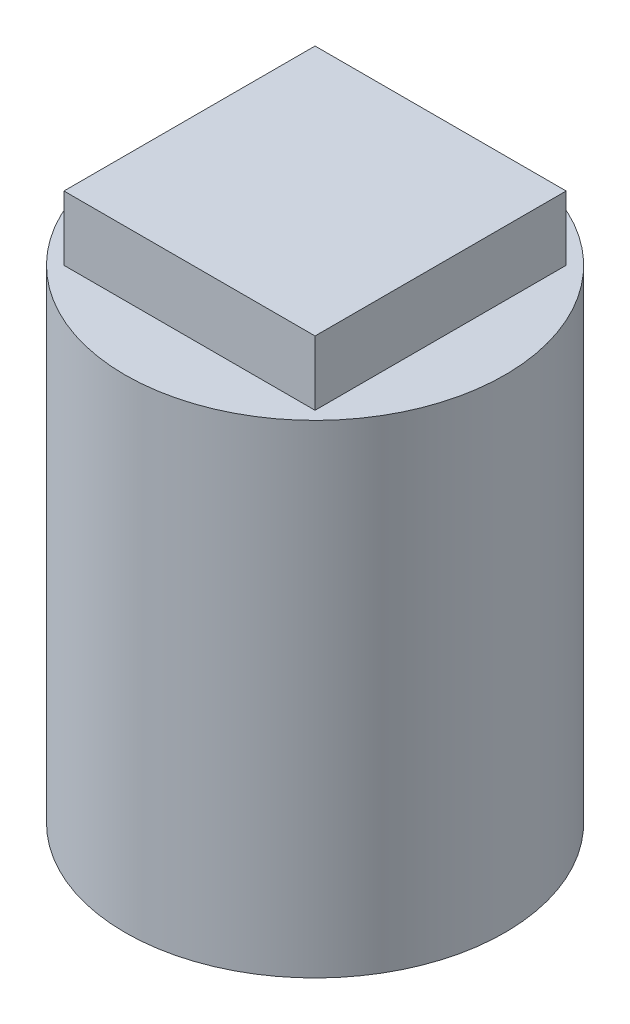
ISO-10303-21;
HEADER;
FILE_DESCRIPTION(('STEP AP214'),'2;1');
FILE_NAME('part.step','',(''),(''),'','','');
FILE_SCHEMA(('AUTOMOTIVE_DESIGN { 1 0 10303 214 1 1 1 1 }'));
ENDSEC;
DATA;
#1=APPLICATION_CONTEXT('core data for automotive mechanical design processes');
#2=APPLICATION_PROTOCOL_DEFINITION('international standard','automotive_design',2000,#1);
#3=PRODUCT_CONTEXT('',#1,'mechanical');
#4=PRODUCT('Part','Part','',(#3));
#5=PRODUCT_RELATED_PRODUCT_CATEGORY('part','',(#4));
#6=PRODUCT_DEFINITION_FORMATION('','',#4);
#7=PRODUCT_DEFINITION_CONTEXT('part definition',#1,'design');
#8=PRODUCT_DEFINITION('design','',#6,#7);
#9=PRODUCT_DEFINITION_SHAPE('','',#8);
#10=(LENGTH_UNIT() NAMED_UNIT(*) SI_UNIT(.MILLI.,.METRE.));
#11=(NAMED_UNIT(*) PLANE_ANGLE_UNIT() SI_UNIT($,.RADIAN.));
#12=(NAMED_UNIT(*) SI_UNIT($,.STERADIAN.) SOLID_ANGLE_UNIT());
#13=UNCERTAINTY_MEASURE_WITH_UNIT(LENGTH_MEASURE(1.E-05),#10,'distance_accuracy_value','');
#14=(GEOMETRIC_REPRESENTATION_CONTEXT(3) GLOBAL_UNCERTAINTY_ASSIGNED_CONTEXT((#13)) GLOBAL_UNIT_ASSIGNED_CONTEXT((#10,
#11,#12)) REPRESENTATION_CONTEXT('',''));
#15=CARTESIAN_POINT('',(0.,0.,0.));
#16=DIRECTION('',(0.,0.,1.));
#17=DIRECTION('',(1.,0.,0.));
#18=AXIS2_PLACEMENT_3D('',#15,#16,#17);
#19=CARTESIAN_POINT('',(0.,7.5,0.));
#20=DIRECTION('',(0.,-1.,0.));
#21=DIRECTION('',(0.,0.,-1.));
#22=AXIS2_PLACEMENT_3D('',#19,#20,#21);
#23=CYLINDRICAL_SURFACE('',#22,2.95);
#24=CARTESIAN_POINT('',(0.,7.5,0.));
#25=DIRECTION('',(0.,1.,0.));
#26=DIRECTION('',(0.,0.,1.));
#27=AXIS2_PLACEMENT_3D('',#24,#25,#26);
#28=CIRCLE('',#27,2.95);
#29=CARTESIAN_POINT('',(0.,7.5,2.95));
#30=VERTEX_POINT('',#29);
#31=EDGE_CURVE('E11',#30,#30,#28,.T.);
#32=ORIENTED_EDGE('',*,*,#31,.F.);
#33=EDGE_LOOP('',(#32));
#34=FACE_BOUND('',#33,.T.);
#35=CARTESIAN_POINT('',(0.,0.,0.));
#36=DIRECTION('',(0.,1.,0.));
#37=DIRECTION('',(0.,0.,1.));
#38=AXIS2_PLACEMENT_3D('',#35,#36,#37);
#39=CIRCLE('',#38,2.95);
#40=CARTESIAN_POINT('',(0.,0.,2.95));
#41=VERTEX_POINT('',#40);
#42=EDGE_CURVE('E42',#41,#41,#39,.T.);
#43=ORIENTED_EDGE('',*,*,#42,.T.);
#44=EDGE_LOOP('',(#43));
#45=FACE_BOUND('',#44,.T.);
#46=ADVANCED_FACE('F39',(#34,#45),#23,.T.);
#47=CARTESIAN_POINT('',(0.,7.5,0.));
#48=DIRECTION('',(0.,1.,0.));
#49=DIRECTION('',(0.,0.,1.));
#50=AXIS2_PLACEMENT_3D('',#47,#48,#49);
#51=PLANE('',#50);
#52=DIRECTION('',(0.,0.,1.));
#53=VECTOR('',#52,1.);
#54=CARTESIAN_POINT('',(-1.95,7.5,-1.95));
#55=LINE('',#54,#53);
#56=CARTESIAN_POINT('',(-1.95,7.5,-1.95));
#57=VERTEX_POINT('',#56);
#58=CARTESIAN_POINT('',(-1.95,7.5,1.95));
#59=VERTEX_POINT('',#58);
#60=EDGE_CURVE('E54',#57,#59,#55,.T.);
#61=ORIENTED_EDGE('',*,*,#60,.F.);
#62=DIRECTION('',(-1.,0.,0.));
#63=VECTOR('',#62,1.);
#64=CARTESIAN_POINT('',(1.95,7.5,-1.95));
#65=LINE('',#64,#63);
#66=CARTESIAN_POINT('',(1.95,7.5,-1.95));
#67=VERTEX_POINT('',#66);
#68=EDGE_CURVE('E58',#67,#57,#65,.T.);
#69=ORIENTED_EDGE('',*,*,#68,.F.);
#70=DIRECTION('',(0.,0.,-1.));
#71=VECTOR('',#70,1.);
#72=CARTESIAN_POINT('',(1.95,7.5,-1.95));
#73=LINE('',#72,#71);
#74=CARTESIAN_POINT('',(1.95,7.5,1.95));
#75=VERTEX_POINT('',#74);
#76=EDGE_CURVE('E118',#75,#67,#73,.T.);
#77=ORIENTED_EDGE('',*,*,#76,.F.);
#78=DIRECTION('',(1.,0.,0.));
#79=VECTOR('',#78,1.);
#80=CARTESIAN_POINT('',(1.95,7.5,1.95));
#81=LINE('',#80,#79);
#82=EDGE_CURVE('E121',#59,#75,#81,.T.);
#83=ORIENTED_EDGE('',*,*,#82,.F.);
#84=EDGE_LOOP('',(#61,#69,#77,#83));
#85=FACE_BOUND('',#84,.T.);
#86=ORIENTED_EDGE('',*,*,#31,.T.);
#87=EDGE_LOOP('',(#86));
#88=FACE_BOUND('',#87,.T.);
#89=ADVANCED_FACE('F143',(#85,#88),#51,.T.);
#90=CARTESIAN_POINT('',(0.,0.,0.));
#91=DIRECTION('',(0.,1.,0.));
#92=DIRECTION('',(0.,0.,1.));
#93=AXIS2_PLACEMENT_3D('',#90,#91,#92);
#94=PLANE('',#93);
#95=ORIENTED_EDGE('',*,*,#42,.F.);
#96=EDGE_LOOP('',(#95));
#97=FACE_BOUND('',#96,.T.);
#98=ADVANCED_FACE('F148',(#97),#94,.F.);
#99=CARTESIAN_POINT('',(-1.95,8.5,-1.95));
#100=DIRECTION('',(1.,0.,0.));
#101=DIRECTION('',(0.,0.,-1.));
#102=AXIS2_PLACEMENT_3D('',#99,#100,#101);
#103=PLANE('',#102);
#104=ORIENTED_EDGE('',*,*,#60,.T.);
#105=DIRECTION('',(0.,-1.,0.));
#106=VECTOR('',#105,1.);
#107=CARTESIAN_POINT('',(-1.95,8.5,1.95));
#108=LINE('',#107,#106);
#109=CARTESIAN_POINT('',(-1.95,8.5,1.95));
#110=VERTEX_POINT('',#109);
#111=EDGE_CURVE('E83',#110,#59,#108,.T.);
#112=ORIENTED_EDGE('',*,*,#111,.F.);
#113=DIRECTION('',(0.,0.,1.));
#114=VECTOR('',#113,1.);
#115=CARTESIAN_POINT('',(-1.95,8.5,-1.95));
#116=LINE('',#115,#114);
#117=CARTESIAN_POINT('',(-1.95,8.5,-1.95));
#118=VERTEX_POINT('',#117);
#119=EDGE_CURVE('E90',#118,#110,#116,.T.);
#120=ORIENTED_EDGE('',*,*,#119,.F.);
#121=DIRECTION('',(0.,-1.,0.));
#122=VECTOR('',#121,1.);
#123=CARTESIAN_POINT('',(-1.95,8.5,-1.95));
#124=LINE('',#123,#122);
#125=EDGE_CURVE('E113',#118,#57,#124,.T.);
#126=ORIENTED_EDGE('',*,*,#125,.T.);
#127=EDGE_LOOP('',(#104,#112,#120,#126));
#128=FACE_BOUND('',#127,.T.);
#129=ADVANCED_FACE('F101',(#128),#103,.F.);
#130=CARTESIAN_POINT('',(1.95,8.5,1.95));
#131=DIRECTION('',(0.,0.,-1.));
#132=DIRECTION('',(-1.,0.,0.));
#133=AXIS2_PLACEMENT_3D('',#130,#131,#132);
#134=PLANE('',#133);
#135=ORIENTED_EDGE('',*,*,#82,.T.);
#136=DIRECTION('',(0.,-1.,0.));
#137=VECTOR('',#136,1.);
#138=CARTESIAN_POINT('',(1.95,8.5,1.95));
#139=LINE('',#138,#137);
#140=CARTESIAN_POINT('',(1.95,8.5,1.95));
#141=VERTEX_POINT('',#140);
#142=EDGE_CURVE('E85',#141,#75,#139,.T.);
#143=ORIENTED_EDGE('',*,*,#142,.F.);
#144=DIRECTION('',(1.,0.,0.));
#145=VECTOR('',#144,1.);
#146=CARTESIAN_POINT('',(1.95,8.5,1.95));
#147=LINE('',#146,#145);
#148=EDGE_CURVE('E78',#110,#141,#147,.T.);
#149=ORIENTED_EDGE('',*,*,#148,.F.);
#150=ORIENTED_EDGE('',*,*,#111,.T.);
#151=EDGE_LOOP('',(#135,#143,#149,#150));
#152=FACE_BOUND('',#151,.T.);
#153=ADVANCED_FACE('F81',(#152),#134,.F.);
#154=CARTESIAN_POINT('',(1.95,8.5,-1.95));
#155=DIRECTION('',(-1.,0.,0.));
#156=DIRECTION('',(0.,0.,1.));
#157=AXIS2_PLACEMENT_3D('',#154,#155,#156);
#158=PLANE('',#157);
#159=ORIENTED_EDGE('',*,*,#76,.T.);
#160=DIRECTION('',(0.,-1.,0.));
#161=VECTOR('',#160,1.);
#162=CARTESIAN_POINT('',(1.95,8.5,-1.95));
#163=LINE('',#162,#161);
#164=CARTESIAN_POINT('',(1.95,8.5,-1.95));
#165=VERTEX_POINT('',#164);
#166=EDGE_CURVE('E107',#165,#67,#163,.T.);
#167=ORIENTED_EDGE('',*,*,#166,.F.);
#168=DIRECTION('',(0.,0.,-1.));
#169=VECTOR('',#168,1.);
#170=CARTESIAN_POINT('',(1.95,8.5,-1.95));
#171=LINE('',#170,#169);
#172=EDGE_CURVE('E89',#141,#165,#171,.T.);
#173=ORIENTED_EDGE('',*,*,#172,.F.);
#174=ORIENTED_EDGE('',*,*,#142,.T.);
#175=EDGE_LOOP('',(#159,#167,#173,#174));
#176=FACE_BOUND('',#175,.T.);
#177=ADVANCED_FACE('F131',(#176),#158,.F.);
#178=CARTESIAN_POINT('',(1.95,8.5,-1.95));
#179=DIRECTION('',(0.,0.,1.));
#180=DIRECTION('',(1.,0.,0.));
#181=AXIS2_PLACEMENT_3D('',#178,#179,#180);
#182=PLANE('',#181);
#183=ORIENTED_EDGE('',*,*,#68,.T.);
#184=ORIENTED_EDGE('',*,*,#125,.F.);
#185=DIRECTION('',(-1.,0.,0.));
#186=VECTOR('',#185,1.);
#187=CARTESIAN_POINT('',(1.95,8.5,-1.95));
#188=LINE('',#187,#186);
#189=EDGE_CURVE('E95',#165,#118,#188,.T.);
#190=ORIENTED_EDGE('',*,*,#189,.F.);
#191=ORIENTED_EDGE('',*,*,#166,.T.);
#192=EDGE_LOOP('',(#183,#184,#190,#191));
#193=FACE_BOUND('',#192,.T.);
#194=ADVANCED_FACE('F133',(#193),#182,.F.);
#195=CARTESIAN_POINT('',(0.,8.5,0.));
#196=DIRECTION('',(0.,-1.,0.));
#197=DIRECTION('',(0.,0.,-1.));
#198=AXIS2_PLACEMENT_3D('',#195,#196,#197);
#199=PLANE('',#198);
#200=ORIENTED_EDGE('',*,*,#119,.T.);
#201=ORIENTED_EDGE('',*,*,#148,.T.);
#202=ORIENTED_EDGE('',*,*,#172,.T.);
#203=ORIENTED_EDGE('',*,*,#189,.T.);
#204=EDGE_LOOP('',(#200,#201,#202,#203));
#205=FACE_BOUND('',#204,.T.);
#206=ADVANCED_FACE('F93',(#205),#199,.F.);
#207=CLOSED_SHELL('',(#46,#89,#98,#129,#153,#177,#194,#206));
#208=MANIFOLD_SOLID_BREP('B2',#207);
#209=ADVANCED_BREP_SHAPE_REPRESENTATION('',(#18,#208),#14);
#210=SHAPE_DEFINITION_REPRESENTATION(#9,#209);
ENDSEC;
END-ISO-10303-21;
